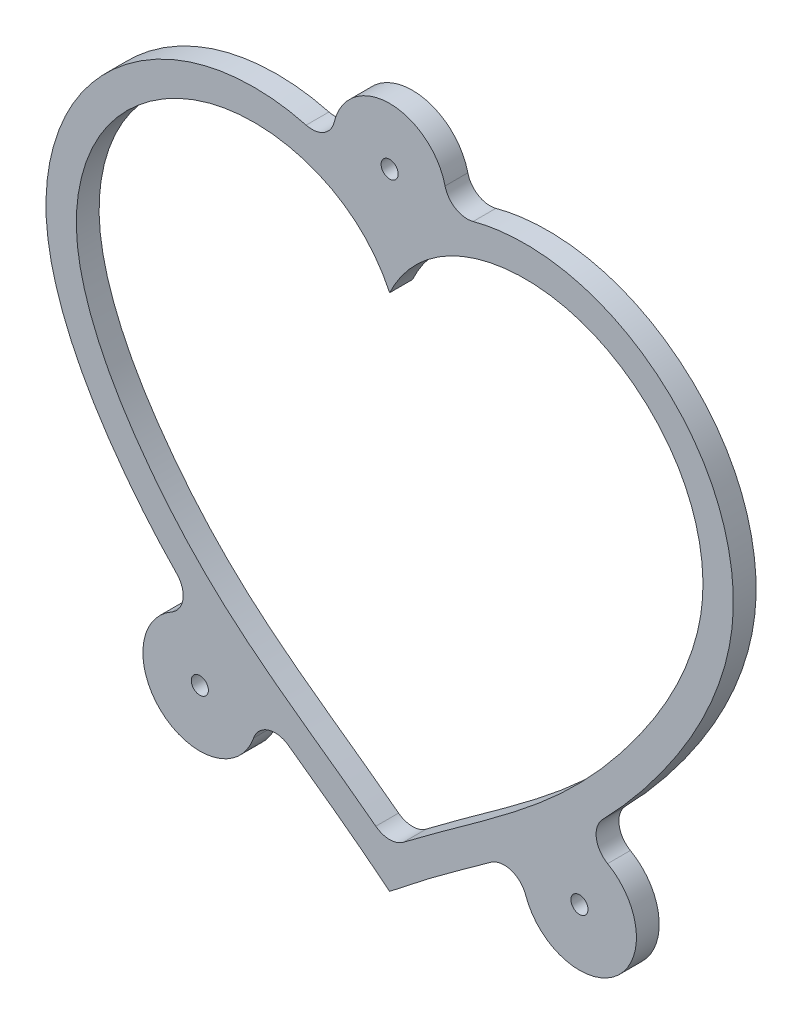
ISO-10303-21;
HEADER;
FILE_DESCRIPTION(('STEP AP214'),'2;1');
FILE_NAME('part.step','',(''),(''),'','','');
FILE_SCHEMA(('AUTOMOTIVE_DESIGN { 1 0 10303 214 1 1 1 1 }'));
ENDSEC;
DATA;
#1=APPLICATION_CONTEXT('core data for automotive mechanical design processes');
#2=APPLICATION_PROTOCOL_DEFINITION('international standard','automotive_design',2000,#1);
#3=PRODUCT_CONTEXT('',#1,'mechanical');
#4=PRODUCT('Part','Part','',(#3));
#5=PRODUCT_RELATED_PRODUCT_CATEGORY('part','',(#4));
#6=PRODUCT_DEFINITION_FORMATION('','',#4);
#7=PRODUCT_DEFINITION_CONTEXT('part definition',#1,'design');
#8=PRODUCT_DEFINITION('design','',#6,#7);
#9=PRODUCT_DEFINITION_SHAPE('','',#8);
#10=(LENGTH_UNIT() NAMED_UNIT(*) SI_UNIT(.MILLI.,.METRE.));
#11=(NAMED_UNIT(*) PLANE_ANGLE_UNIT() SI_UNIT($,.RADIAN.));
#12=(NAMED_UNIT(*) SI_UNIT($,.STERADIAN.) SOLID_ANGLE_UNIT());
#13=UNCERTAINTY_MEASURE_WITH_UNIT(LENGTH_MEASURE(1.E-05),#10,'distance_accuracy_value','');
#14=(GEOMETRIC_REPRESENTATION_CONTEXT(3) GLOBAL_UNCERTAINTY_ASSIGNED_CONTEXT((#13)) GLOBAL_UNIT_ASSIGNED_CONTEXT((#10,
#11,#12)) REPRESENTATION_CONTEXT('',''));
#15=CARTESIAN_POINT('',(0.,0.,0.));
#16=DIRECTION('',(0.,0.,1.));
#17=DIRECTION('',(1.,0.,0.));
#18=AXIS2_PLACEMENT_3D('',#15,#16,#17);
#19=CARTESIAN_POINT('',(82.4726160950661,-10.2094009049258,6.));
#20=CARTESIAN_POINT('',(83.4714639574229,-9.41745694634924,6.));
#21=CARTESIAN_POINT('',(84.9645223253859,-8.23383301928179,6.));
#22=CARTESIAN_POINT('',(86.9761205182926,-6.63849974000241,6.));
#23=CARTESIAN_POINT('',(88.9182063702341,-5.10039327135454,6.));
#24=CARTESIAN_POINT('',(91.3656471995338,-3.21331902466197,6.));
#25=CARTESIAN_POINT('',(95.3579281311431,-0.210302632343623,6.));
#26=CARTESIAN_POINT('',(100.453917795638,3.50911955569531,6.));
#27=CARTESIAN_POINT('',(108.764929662189,9.48183813336912,6.));
#28=CARTESIAN_POINT('',(119.291741188994,17.144694680426,6.));
#29=CARTESIAN_POINT('',(129.618307931992,25.5586824907125,6.));
#30=CARTESIAN_POINT('',(137.443209961277,33.0087837344442,6.));
#31=CARTESIAN_POINT('',(144.859917451755,40.8364073254824,6.));
#32=CARTESIAN_POINT('',(151.674556145459,49.219363645059,6.));
#33=CARTESIAN_POINT('',(157.859264063419,58.0742525719499,6.));
#34=CARTESIAN_POINT('',(162.17432774299,65.0719663575805,6.));
#35=CARTESIAN_POINT('',(166.016075969879,72.455491772311,6.));
#36=CARTESIAN_POINT('',(169.258908350085,80.2437219507198,6.));
#37=CARTESIAN_POINT('',(171.755986150504,88.5629358572733,6.));
#38=CARTESIAN_POINT('',(173.140367723534,97.4252357863841,6.));
#39=CARTESIAN_POINT('',(172.977670445687,106.596327776455,6.));
#40=CARTESIAN_POINT('',(171.275944480674,115.572236386053,6.));
#41=CARTESIAN_POINT('',(168.086640527527,124.198944653081,6.));
#42=CARTESIAN_POINT('',(163.387201588641,132.199804754494,6.));
#43=CARTESIAN_POINT('',(157.426131983563,139.212591541545,6.));
#44=CARTESIAN_POINT('',(150.41006343557,145.163269136889,6.));
#45=CARTESIAN_POINT('',(142.522093284897,149.916495524305,6.));
#46=CARTESIAN_POINT('',(133.911988841613,153.340421029907,6.));
#47=CARTESIAN_POINT('',(124.814763458287,155.238581255719,6.));
#48=CARTESIAN_POINT('',(115.589351661553,155.582375027217,6.));
#49=CARTESIAN_POINT('',(106.444811245433,154.368542179928,6.));
#50=CARTESIAN_POINT('',(97.6398439983744,151.550198602041,6.));
#51=CARTESIAN_POINT('',(90.8163224260135,147.801965868724,6.));
#52=CARTESIAN_POINT('',(85.8526566419993,143.947549857758,6.));
#53=CARTESIAN_POINT('',(83.5505977943366,141.713863228974,6.));
#54=CARTESIAN_POINT('',(82.472616095066,140.542379671031,6.));
#55=B_SPLINE_CURVE_WITH_KNOTS('',3,(#19,#20,#21,#22,#23,#24,#25,#26,#27,#28,#29,#30,#31,#32,#33,
#34,#35,#36,#37,#38,#39,#40,#41,#42,#43,#44,#45,#46,#47,#48,#49,#50,#51,#52,#53,#54),
.UNSPECIFIED.,.F.,.F.,(4,1,1,1,1,1,1,1,1,1,1,1,1,1,1,1,1,1,1,1,1,1,1,1,1,1,1,1,1,1,1,1,1,4),
(-0.0255266342744863,-0.0101366089676064,-0.00244159631416641,0.00525341633927356,
0.0206434416461535,0.0360334669530334,0.0668135175667933,0.0975935681805533,0.159153669408073,
0.220713770635593,0.251493821249353,0.282273871863113,0.343833973090632,0.374614023704392,
0.405394074318152,0.436174124931912,0.466954175545672,0.497734226159432,0.528514276773192,
0.559294327386952,0.590074378000712,0.620854428614472,0.651634479228232,0.682414529841991,
0.713194580455751,0.743974631069511,0.774754681683271,0.805534732297031,0.836314782910791,
0.867094833524551,0.897874884138311,0.928654934752071,0.94404496005895,0.95943498536583),.UNSPECIFIED.);
#56=DIRECTION('',(0.,0.,-1.));
#57=VECTOR('',#56,1.);
#58=SURFACE_OF_LINEAR_EXTRUSION('',#55,#57);
#59=CARTESIAN_POINT('',(82.4726160950661,-10.2094009049258,0.));
#60=CARTESIAN_POINT('',(83.4714639574229,-9.41745694634924,0.));
#61=CARTESIAN_POINT('',(84.9645223253859,-8.23383301928179,0.));
#62=CARTESIAN_POINT('',(86.9761205182926,-6.63849974000241,0.));
#63=CARTESIAN_POINT('',(88.9182063702341,-5.10039327135454,0.));
#64=CARTESIAN_POINT('',(91.3656471995338,-3.21331902466197,0.));
#65=CARTESIAN_POINT('',(95.3579281311431,-0.210302632343623,0.));
#66=CARTESIAN_POINT('',(100.453917795638,3.50911955569531,0.));
#67=CARTESIAN_POINT('',(108.764929662189,9.48183813336912,0.));
#68=CARTESIAN_POINT('',(119.291741188994,17.144694680426,0.));
#69=CARTESIAN_POINT('',(129.618307931992,25.5586824907125,0.));
#70=CARTESIAN_POINT('',(137.443209961277,33.0087837344442,0.));
#71=CARTESIAN_POINT('',(144.859917451755,40.8364073254824,0.));
#72=CARTESIAN_POINT('',(151.674556145459,49.219363645059,0.));
#73=CARTESIAN_POINT('',(157.859264063419,58.0742525719499,0.));
#74=CARTESIAN_POINT('',(162.17432774299,65.0719663575805,0.));
#75=CARTESIAN_POINT('',(166.016075969879,72.455491772311,0.));
#76=CARTESIAN_POINT('',(169.258908350085,80.2437219507198,0.));
#77=CARTESIAN_POINT('',(171.755986150504,88.5629358572733,0.));
#78=CARTESIAN_POINT('',(173.140367723534,97.4252357863841,0.));
#79=CARTESIAN_POINT('',(172.977670445687,106.596327776455,0.));
#80=CARTESIAN_POINT('',(171.275944480674,115.572236386053,0.));
#81=CARTESIAN_POINT('',(168.086640527527,124.198944653081,0.));
#82=CARTESIAN_POINT('',(163.387201588641,132.199804754494,0.));
#83=CARTESIAN_POINT('',(157.426131983563,139.212591541545,0.));
#84=CARTESIAN_POINT('',(150.41006343557,145.163269136889,0.));
#85=CARTESIAN_POINT('',(142.522093284897,149.916495524305,0.));
#86=CARTESIAN_POINT('',(133.911988841613,153.340421029907,0.));
#87=CARTESIAN_POINT('',(124.814763458287,155.238581255719,0.));
#88=CARTESIAN_POINT('',(115.589351661553,155.582375027217,0.));
#89=CARTESIAN_POINT('',(106.444811245433,154.368542179928,0.));
#90=CARTESIAN_POINT('',(97.6398439983744,151.550198602041,0.));
#91=CARTESIAN_POINT('',(90.8163224260135,147.801965868724,0.));
#92=CARTESIAN_POINT('',(85.8526566419993,143.947549857758,0.));
#93=CARTESIAN_POINT('',(83.5505977943366,141.713863228974,0.));
#94=CARTESIAN_POINT('',(82.472616095066,140.542379671031,0.));
#95=B_SPLINE_CURVE_WITH_KNOTS('',3,(#59,#60,#61,#62,#63,#64,#65,#66,#67,#68,#69,#70,#71,#72,#73,
#74,#75,#76,#77,#78,#79,#80,#81,#82,#83,#84,#85,#86,#87,#88,#89,#90,#91,#92,#93,#94),
.UNSPECIFIED.,.F.,.F.,(4,1,1,1,1,1,1,1,1,1,1,1,1,1,1,1,1,1,1,1,1,1,1,1,1,1,1,1,1,1,1,1,1,4),
(-0.0255266342744863,-0.0101366089676064,-0.00244159631416641,0.00525341633927356,
0.0206434416461535,0.0360334669530334,0.0668135175667933,0.0975935681805533,0.159153669408073,
0.220713770635593,0.251493821249353,0.282273871863113,0.343833973090632,0.374614023704392,
0.405394074318152,0.436174124931912,0.466954175545672,0.497734226159432,0.528514276773192,
0.559294327386952,0.590074378000712,0.620854428614472,0.651634479228232,0.682414529841991,
0.713194580455751,0.743974631069511,0.774754681683271,0.805534732297031,0.836314782910791,
0.867094833524551,0.897874884138311,0.928654934752071,0.94404496005895,0.95943498536583),.UNSPECIFIED.);
#96=CARTESIAN_POINT('',(82.4726160950661,-10.2094009049258,0.));
#97=VERTEX_POINT('',#96);
#98=CARTESIAN_POINT('',(109.113832741653,9.75063396404658,0.));
#99=VERTEX_POINT('',#98);
#100=EDGE_CURVE('E209',#97,#99,#95,.T.);
#101=ORIENTED_EDGE('',*,*,#100,.T.);
#102=DIRECTION('',(0.,0.,-1.));
#103=VECTOR('',#102,1.);
#104=CARTESIAN_POINT('',(109.113832741653,9.75063396404658,0.));
#105=LINE('',#104,#103);
#106=CARTESIAN_POINT('',(109.113832741653,9.75063396404658,6.));
#107=VERTEX_POINT('',#106);
#108=EDGE_CURVE('E251',#99,#107,#105,.F.);
#109=ORIENTED_EDGE('',*,*,#108,.T.);
#110=CARTESIAN_POINT('',(82.4726160950661,-10.2094009049258,6.));
#111=VERTEX_POINT('',#110);
#112=EDGE_CURVE('E205',#111,#107,#55,.T.);
#113=ORIENTED_EDGE('',*,*,#112,.F.);
#114=DIRECTION('',(0.,0.,-1.));
#115=VECTOR('',#114,1.);
#116=CARTESIAN_POINT('',(82.4726160950661,-10.2094009049258,6.));
#117=LINE('',#116,#115);
#118=EDGE_CURVE('E225',#111,#97,#117,.T.);
#119=ORIENTED_EDGE('',*,*,#118,.T.);
#120=EDGE_LOOP('',(#101,#109,#113,#119));
#121=FACE_BOUND('',#120,.T.);
#122=ADVANCED_FACE('F33',(#121),#58,.F.);
#123=CARTESIAN_POINT('',(82.4726160950661,140.542379671031,6.));
#124=CARTESIAN_POINT('',(81.3946343957955,141.713863228974,6.));
#125=CARTESIAN_POINT('',(79.0925755481329,143.947549857758,6.));
#126=CARTESIAN_POINT('',(74.1289097641186,147.801965868724,6.));
#127=CARTESIAN_POINT('',(67.3053881917577,151.550198602041,6.));
#128=CARTESIAN_POINT('',(58.500420944699,154.368542179928,6.));
#129=CARTESIAN_POINT('',(49.3558805285793,155.582375027217,6.));
#130=CARTESIAN_POINT('',(40.1304687318451,155.23858125572,6.));
#131=CARTESIAN_POINT('',(31.0332433485191,153.340421029907,6.));
#132=CARTESIAN_POINT('',(22.4231389052352,149.916495524305,6.));
#133=CARTESIAN_POINT('',(14.5351687545622,145.163269136889,6.));
#134=CARTESIAN_POINT('',(7.5191002065696,139.212591541545,6.));
#135=CARTESIAN_POINT('',(1.55803060149126,132.199804754494,6.));
#136=CARTESIAN_POINT('',(-3.14140833739441,124.198944653081,6.));
#137=CARTESIAN_POINT('',(-6.33071229054134,115.572236386053,6.));
#138=CARTESIAN_POINT('',(-8.03243825555483,106.596327776455,6.));
#139=CARTESIAN_POINT('',(-8.19513553340165,97.4252357863841,6.));
#140=CARTESIAN_POINT('',(-6.81075396037155,88.5629358572733,6.));
#141=CARTESIAN_POINT('',(-4.31367615995275,80.2437219507198,6.));
#142=CARTESIAN_POINT('',(-1.07084377974669,72.455491772311,6.));
#143=CARTESIAN_POINT('',(2.770904447142,65.0719663575805,6.));
#144=CARTESIAN_POINT('',(7.08596812671271,58.0742525719499,6.));
#145=CARTESIAN_POINT('',(13.2706760446727,49.219363645059,6.));
#146=CARTESIAN_POINT('',(20.0853147383774,40.8364073254824,6.));
#147=CARTESIAN_POINT('',(27.5020222288551,33.0087837344442,6.));
#148=CARTESIAN_POINT('',(35.3269242581406,25.5586824907125,6.));
#149=CARTESIAN_POINT('',(45.6534910011384,17.144694680426,6.));
#150=CARTESIAN_POINT('',(56.1803025279432,9.48183813336911,6.));
#151=CARTESIAN_POINT('',(64.4913143944945,3.50911955569532,6.));
#152=CARTESIAN_POINT('',(69.587304058989,-0.21030263234362,6.));
#153=CARTESIAN_POINT('',(73.5795849905983,-3.21331902466197,6.));
#154=CARTESIAN_POINT('',(76.027025819898,-5.10039327135453,6.));
#155=CARTESIAN_POINT('',(77.9691116718395,-6.63849974000241,6.));
#156=CARTESIAN_POINT('',(79.9807098647463,-8.23383301928179,6.));
#157=CARTESIAN_POINT('',(81.4737682327092,-9.41745694634924,6.));
#158=CARTESIAN_POINT('',(82.4726160950661,-10.2094009049258,6.));
#159=B_SPLINE_CURVE_WITH_KNOTS('',3,(#123,#124,#125,#126,#127,#128,#129,#130,#131,#132,#133,
#134,#135,#136,#137,#138,#139,#140,#141,#142,#143,#144,#145,#146,#147,#148,#149,#150,#151,#152,
#153,#154,#155,#156,#157,#158),.UNSPECIFIED.,.F.,.F.,(4,1,1,1,1,1,1,1,1,1,1,1,1,1,1,1,1,1,1,1,1,
1,1,1,1,1,1,1,1,1,1,1,1,4),(-0.0255266342744863,-0.0101366089676063,0.00525341633927368,
0.0360334669530336,0.0668135175667934,0.0975935681805533,0.128373618794313,0.159153669408073,
0.189933720021833,0.220713770635593,0.251493821249353,0.282273871863113,0.313053922476872,
0.343833973090632,0.374614023704392,0.405394074318152,0.436174124931912,0.466954175545672,
0.497734226159432,0.528514276773192,0.559294327386952,0.590074378000712,0.651634479228231,
0.682414529841991,0.713194580455751,0.774754681683271,0.836314782910791,0.867094833524551,
0.897874884138311,0.913264909445191,0.928654934752071,0.936349947405511,0.944044960058951,
0.95943498536583),.UNSPECIFIED.);
#160=DIRECTION('',(0.,0.,-1.));
#161=VECTOR('',#160,1.);
#162=SURFACE_OF_LINEAR_EXTRUSION('',#159,#161);
#163=CARTESIAN_POINT('',(60.4859567395278,153.598191897514,6.));
#164=VERTEX_POINT('',#163);
#165=CARTESIAN_POINT('',(26.3854413563127,34.2387781694007,6.));
#166=VERTEX_POINT('',#165);
#167=EDGE_CURVE('E204',#164,#166,#159,.T.);
#168=ORIENTED_EDGE('',*,*,#167,.F.);
#169=DIRECTION('',(0.,0.,-1.));
#170=VECTOR('',#169,1.);
#171=CARTESIAN_POINT('',(60.4859567395278,153.598191897514,6.));
#172=LINE('',#171,#170);
#173=CARTESIAN_POINT('',(60.4859567395278,153.598191897514,0.));
#174=VERTEX_POINT('',#173);
#175=EDGE_CURVE('E234',#164,#174,#172,.T.);
#176=ORIENTED_EDGE('',*,*,#175,.T.);
#177=CARTESIAN_POINT('',(82.4726160950661,140.542379671031,0.));
#178=CARTESIAN_POINT('',(81.3946343957955,141.713863228974,0.));
#179=CARTESIAN_POINT('',(79.0925755481329,143.947549857758,0.));
#180=CARTESIAN_POINT('',(74.1289097641186,147.801965868724,0.));
#181=CARTESIAN_POINT('',(67.3053881917577,151.550198602041,0.));
#182=CARTESIAN_POINT('',(58.500420944699,154.368542179928,0.));
#183=CARTESIAN_POINT('',(49.3558805285793,155.582375027217,0.));
#184=CARTESIAN_POINT('',(40.1304687318451,155.23858125572,0.));
#185=CARTESIAN_POINT('',(31.0332433485191,153.340421029907,0.));
#186=CARTESIAN_POINT('',(22.4231389052352,149.916495524305,0.));
#187=CARTESIAN_POINT('',(14.5351687545622,145.163269136889,0.));
#188=CARTESIAN_POINT('',(7.5191002065696,139.212591541545,0.));
#189=CARTESIAN_POINT('',(1.55803060149126,132.199804754494,0.));
#190=CARTESIAN_POINT('',(-3.14140833739441,124.198944653081,0.));
#191=CARTESIAN_POINT('',(-6.33071229054134,115.572236386053,0.));
#192=CARTESIAN_POINT('',(-8.03243825555483,106.596327776455,0.));
#193=CARTESIAN_POINT('',(-8.19513553340165,97.4252357863841,0.));
#194=CARTESIAN_POINT('',(-6.81075396037155,88.5629358572733,0.));
#195=CARTESIAN_POINT('',(-4.31367615995275,80.2437219507198,0.));
#196=CARTESIAN_POINT('',(-1.07084377974669,72.455491772311,0.));
#197=CARTESIAN_POINT('',(2.770904447142,65.0719663575805,0.));
#198=CARTESIAN_POINT('',(7.08596812671271,58.0742525719499,0.));
#199=CARTESIAN_POINT('',(13.2706760446727,49.219363645059,0.));
#200=CARTESIAN_POINT('',(20.0853147383774,40.8364073254824,0.));
#201=CARTESIAN_POINT('',(27.5020222288551,33.0087837344442,0.));
#202=CARTESIAN_POINT('',(35.3269242581406,25.5586824907125,0.));
#203=CARTESIAN_POINT('',(45.6534910011384,17.144694680426,0.));
#204=CARTESIAN_POINT('',(56.1803025279432,9.48183813336911,0.));
#205=CARTESIAN_POINT('',(64.4913143944945,3.50911955569532,0.));
#206=CARTESIAN_POINT('',(69.587304058989,-0.21030263234362,0.));
#207=CARTESIAN_POINT('',(73.5795849905983,-3.21331902466197,0.));
#208=CARTESIAN_POINT('',(76.027025819898,-5.10039327135453,0.));
#209=CARTESIAN_POINT('',(77.9691116718395,-6.63849974000241,0.));
#210=CARTESIAN_POINT('',(79.9807098647463,-8.23383301928179,0.));
#211=CARTESIAN_POINT('',(81.4737682327092,-9.41745694634924,0.));
#212=CARTESIAN_POINT('',(82.4726160950661,-10.2094009049258,0.));
#213=B_SPLINE_CURVE_WITH_KNOTS('',3,(#177,#178,#179,#180,#181,#182,#183,#184,#185,#186,#187,
#188,#189,#190,#191,#192,#193,#194,#195,#196,#197,#198,#199,#200,#201,#202,#203,#204,#205,#206,
#207,#208,#209,#210,#211,#212),.UNSPECIFIED.,.F.,.F.,(4,1,1,1,1,1,1,1,1,1,1,1,1,1,1,1,1,1,1,1,1,
1,1,1,1,1,1,1,1,1,1,1,1,4),(-0.0255266342744863,-0.0101366089676063,0.00525341633927368,
0.0360334669530336,0.0668135175667934,0.0975935681805533,0.128373618794313,0.159153669408073,
0.189933720021833,0.220713770635593,0.251493821249353,0.282273871863113,0.313053922476872,
0.343833973090632,0.374614023704392,0.405394074318152,0.436174124931912,0.466954175545672,
0.497734226159432,0.528514276773192,0.559294327386952,0.590074378000712,0.651634479228231,
0.682414529841991,0.713194580455751,0.774754681683271,0.836314782910791,0.867094833524551,
0.897874884138311,0.913264909445191,0.928654934752071,0.936349947405511,0.944044960058951,
0.95943498536583),.UNSPECIFIED.);
#214=CARTESIAN_POINT('',(26.3854413563127,34.2387781694007,0.));
#215=VERTEX_POINT('',#214);
#216=EDGE_CURVE('E224',#174,#215,#213,.T.);
#217=ORIENTED_EDGE('',*,*,#216,.T.);
#218=DIRECTION('',(0.,0.,-1.));
#219=VECTOR('',#218,1.);
#220=CARTESIAN_POINT('',(26.3854413563127,34.2387781694007,0.));
#221=LINE('',#220,#219);
#222=EDGE_CURVE('E231',#215,#166,#221,.F.);
#223=ORIENTED_EDGE('',*,*,#222,.T.);
#224=EDGE_LOOP('',(#168,#176,#217,#223));
#225=FACE_BOUND('',#224,.T.);
#226=ADVANCED_FACE('F187',(#225),#162,.F.);
#227=CARTESIAN_POINT('',(169.13461592012,80.3322192387439,6.));
#228=DIRECTION('',(0.,0.,1.));
#229=DIRECTION('',(1.,0.,0.));
#230=AXIS2_PLACEMENT_3D('',#227,#228,#229);
#231=PLANE('',#230);
#232=CARTESIAN_POINT('',(138.559790833819,34.2387781694007,6.));
#233=VERTEX_POINT('',#232);
#234=CARTESIAN_POINT('',(104.459275450604,153.598191897514,6.));
#235=VERTEX_POINT('',#234);
#236=EDGE_CURVE('E379',#233,#235,#55,.T.);
#237=ORIENTED_EDGE('',*,*,#236,.T.);
#238=CARTESIAN_POINT('',(102.904665601867,159.393292260598,6.));
#239=DIRECTION('',(0.,0.,1.));
#240=DIRECTION('',(1.,0.,0.));
#241=AXIS2_PLACEMENT_3D('',#238,#239,#240);
#242=CIRCLE('',#241,6.);
#243=CARTESIAN_POINT('',(97.0669371713527,158.007317235007,6.));
#244=VERTEX_POINT('',#243);
#245=EDGE_CURVE('E268',#235,#244,#242,.F.);
#246=ORIENTED_EDGE('',*,*,#245,.T.);
#247=CARTESIAN_POINT('',(82.4726160950661,154.542379671031,6.));
#248=DIRECTION('',(0.,0.,1.));
#249=DIRECTION('',(1.,0.,0.));
#250=AXIS2_PLACEMENT_3D('',#247,#248,#249);
#251=CIRCLE('',#250,15.);
#252=CARTESIAN_POINT('',(67.8782950187795,158.007317235007,6.));
#253=VERTEX_POINT('',#252);
#254=EDGE_CURVE('E329',#244,#253,#251,.T.);
#255=ORIENTED_EDGE('',*,*,#254,.T.);
#256=CARTESIAN_POINT('',(62.0405665882648,159.393292260598,6.));
#257=DIRECTION('',(0.,0.,1.));
#258=DIRECTION('',(1.,0.,0.));
#259=AXIS2_PLACEMENT_3D('',#256,#257,#258);
#260=CIRCLE('',#259,6.);
#261=EDGE_CURVE('E266',#253,#164,#260,.F.);
#262=ORIENTED_EDGE('',*,*,#261,.T.);
#263=ORIENTED_EDGE('',*,*,#167,.T.);
#264=CARTESIAN_POINT('',(22.0932654357811,30.0462579408021,6.));
#265=DIRECTION('',(0.,0.,1.));
#266=DIRECTION('',(1.,0.,0.));
#267=AXIS2_PLACEMENT_3D('',#264,#265,#266);
#268=CIRCLE('',#267,6.);
#269=CARTESIAN_POINT('',(25.0587941955768,24.8303554134513,6.));
#270=VERTEX_POINT('',#269);
#271=EDGE_CURVE('E280',#166,#270,#268,.F.);
#272=ORIENTED_EDGE('',*,*,#271,.T.);
#273=CARTESIAN_POINT('',(32.4726160950661,11.7905990950742,6.));
#274=DIRECTION('',(0.,0.,1.));
#275=DIRECTION('',(1.,0.,0.));
#276=AXIS2_PLACEMENT_3D('',#273,#274,#275);
#277=CIRCLE('',#276,15.);
#278=CARTESIAN_POINT('',(46.6406931491267,6.86458726092274,6.));
#279=VERTEX_POINT('',#278);
#280=EDGE_CURVE('E169',#270,#279,#277,.T.);
#281=ORIENTED_EDGE('',*,*,#280,.T.);
#282=CARTESIAN_POINT('',(52.307923970751,4.89418252726215,6.));
#283=DIRECTION('',(0.,0.,1.));
#284=DIRECTION('',(1.,0.,0.));
#285=AXIS2_PLACEMENT_3D('',#282,#283,#284);
#286=CIRCLE('',#285,6.);
#287=CARTESIAN_POINT('',(55.8313994484795,9.75063396404657,6.));
#288=VERTEX_POINT('',#287);
#289=EDGE_CURVE('E286',#279,#288,#286,.F.);
#290=ORIENTED_EDGE('',*,*,#289,.T.);
#291=EDGE_CURVE('E199',#288,#111,#159,.T.);
#292=ORIENTED_EDGE('',*,*,#291,.T.);
#293=ORIENTED_EDGE('',*,*,#112,.T.);
#294=CARTESIAN_POINT('',(112.637308219381,4.89418252726216,6.));
#295=DIRECTION('',(0.,0.,1.));
#296=DIRECTION('',(1.,0.,0.));
#297=AXIS2_PLACEMENT_3D('',#294,#295,#296);
#298=CIRCLE('',#297,6.);
#299=CARTESIAN_POINT('',(118.304539041005,6.86458726092274,6.));
#300=VERTEX_POINT('',#299);
#301=EDGE_CURVE('E276',#107,#300,#298,.F.);
#302=ORIENTED_EDGE('',*,*,#301,.T.);
#303=CARTESIAN_POINT('',(132.472616095066,11.7905990950742,6.));
#304=DIRECTION('',(0.,0.,1.));
#305=DIRECTION('',(-1.,0.,0.));
#306=AXIS2_PLACEMENT_3D('',#303,#304,#305);
#307=CIRCLE('',#306,15.);
#308=CARTESIAN_POINT('',(139.886437994555,24.8303554134513,6.));
#309=VERTEX_POINT('',#308);
#310=EDGE_CURVE('E317',#300,#309,#307,.T.);
#311=ORIENTED_EDGE('',*,*,#310,.T.);
#312=CARTESIAN_POINT('',(142.851966754351,30.0462579408021,6.));
#313=DIRECTION('',(0.,0.,1.));
#314=DIRECTION('',(1.,0.,0.));
#315=AXIS2_PLACEMENT_3D('',#312,#313,#314);
#316=CIRCLE('',#315,6.);
#317=EDGE_CURVE('E274',#309,#233,#316,.F.);
#318=ORIENTED_EDGE('',*,*,#317,.T.);
#319=EDGE_LOOP('',(#237,#246,#255,#262,#263,#272,#281,#290,#292,#293,#302,#311,#318));
#320=FACE_BOUND('',#319,.T.);
#321=CARTESIAN_POINT('',(82.4726160950661,0.,6.));
#322=CARTESIAN_POINT('',(97.00136512069,11.5192267512776,6.));
#323=CARTESIAN_POINT('',(122.367511009724,27.1596645276851,6.));
#324=CARTESIAN_POINT('',(147.66445544593,55.9473525286211,6.));
#325=CARTESIAN_POINT('',(160.776944751644,78.1075815529436,6.));
#326=CARTESIAN_POINT('',(166.836954821545,100.903984809001,6.));
#327=CARTESIAN_POINT('',(160.564003732808,128.294665652817,6.));
#328=CARTESIAN_POINT('',(126.577250321467,154.854375307356,6.));
#329=CARTESIAN_POINT('',(91.0666211872104,144.596317398055,6.));
#330=CARTESIAN_POINT('',(82.4726160950661,126.350308344485,6.));
#331=B_SPLINE_CURVE_WITH_KNOTS('',3,(#321,#322,#323,#324,#325,#326,#327,#328,#329,#330),
.UNSPECIFIED.,.F.,.F.,(4,1,1,1,1,1,1,4),(0.,0.22385572779228,0.354281410137953,0.45743514941976,
0.531451174408718,0.633256173985896,0.77721075461617,1.),.UNSPECIFIED.);
#332=CARTESIAN_POINT('',(86.1166810580877,2.83508288700521,6.));
#333=VERTEX_POINT('',#332);
#334=CARTESIAN_POINT('',(82.4726160950661,126.350308344485,6.));
#335=VERTEX_POINT('',#334);
#336=EDGE_CURVE('E142',#333,#335,#331,.T.);
#337=ORIENTED_EDGE('',*,*,#336,.F.);
#338=CARTESIAN_POINT('',(82.4726160950661,7.6017159277666,6.));
#339=DIRECTION('',(0.,0.,1.));
#340=DIRECTION('',(1.,0.,0.));
#341=AXIS2_PLACEMENT_3D('',#338,#339,#340);
#342=CIRCLE('',#341,6.);
#343=CARTESIAN_POINT('',(78.8285511320444,2.83508288700521,6.));
#344=VERTEX_POINT('',#343);
#345=EDGE_CURVE('E11',#333,#344,#342,.F.);
#346=ORIENTED_EDGE('',*,*,#345,.T.);
#347=CARTESIAN_POINT('',(82.4726160950661,126.350308344485,6.));
#348=CARTESIAN_POINT('',(73.8786110029217,144.596317398055,6.));
#349=CARTESIAN_POINT('',(38.367981868665,154.854375307356,6.));
#350=CARTESIAN_POINT('',(4.38122845732449,128.294665652817,6.));
#351=CARTESIAN_POINT('',(-1.89172263141334,100.903984809001,6.));
#352=CARTESIAN_POINT('',(4.16828743848839,78.1075815529436,6.));
#353=CARTESIAN_POINT('',(17.2807767442023,55.9473525286211,6.));
#354=CARTESIAN_POINT('',(42.5777211804077,27.1596645276851,6.));
#355=CARTESIAN_POINT('',(67.9438670694421,11.5192267512776,6.));
#356=CARTESIAN_POINT('',(82.4726160950661,0.,6.));
#357=B_SPLINE_CURVE_WITH_KNOTS('',3,(#347,#348,#349,#350,#351,#352,#353,#354,#355,#356),
.UNSPECIFIED.,.F.,.F.,(4,1,1,1,1,1,1,4),(0.,0.22278924538383,0.366743826014104,
0.468548825591282,0.54256485058024,0.645718589862047,0.77614427220772,1.),.UNSPECIFIED.);
#358=EDGE_CURVE('E149',#335,#344,#357,.T.);
#359=ORIENTED_EDGE('',*,*,#358,.F.);
#360=EDGE_LOOP('',(#337,#346,#359));
#361=FACE_BOUND('',#360,.T.);
#362=CARTESIAN_POINT('',(32.4726160950661,11.7905990950742,6.));
#363=DIRECTION('',(0.,0.,1.));
#364=DIRECTION('',(1.,0.,0.));
#365=AXIS2_PLACEMENT_3D('',#362,#363,#364);
#366=CIRCLE('',#365,2.25);
#367=CARTESIAN_POINT('',(34.7226160950661,11.7905990950742,6.));
#368=VERTEX_POINT('',#367);
#369=EDGE_CURVE('E311',#368,#368,#366,.T.);
#370=ORIENTED_EDGE('',*,*,#369,.F.);
#371=EDGE_LOOP('',(#370));
#372=FACE_BOUND('',#371,.T.);
#373=CARTESIAN_POINT('',(132.472616095066,11.7905990950742,6.));
#374=DIRECTION('',(0.,0.,1.));
#375=DIRECTION('',(-1.,0.,0.));
#376=AXIS2_PLACEMENT_3D('',#373,#374,#375);
#377=CIRCLE('',#376,2.25000000000001);
#378=CARTESIAN_POINT('',(130.222616095066,11.7905990950742,6.));
#379=VERTEX_POINT('',#378);
#380=EDGE_CURVE('E323',#379,#379,#377,.T.);
#381=ORIENTED_EDGE('',*,*,#380,.F.);
#382=EDGE_LOOP('',(#381));
#383=FACE_BOUND('',#382,.T.);
#384=CARTESIAN_POINT('',(82.4726160950661,154.542379671031,6.));
#385=DIRECTION('',(0.,0.,1.));
#386=DIRECTION('',(1.,0.,0.));
#387=AXIS2_PLACEMENT_3D('',#384,#385,#386);
#388=CIRCLE('',#387,2.25);
#389=CARTESIAN_POINT('',(84.7226160950661,154.542379671031,6.));
#390=VERTEX_POINT('',#389);
#391=EDGE_CURVE('E335',#390,#390,#388,.T.);
#392=ORIENTED_EDGE('',*,*,#391,.F.);
#393=EDGE_LOOP('',(#392));
#394=FACE_BOUND('',#393,.T.);
#395=ADVANCED_FACE('F160',(#320,#361,#372,#383,#394),#231,.T.);
#396=CARTESIAN_POINT('',(169.13461592012,80.3322192387439,0.));
#397=DIRECTION('',(0.,0.,1.));
#398=DIRECTION('',(1.,0.,0.));
#399=AXIS2_PLACEMENT_3D('',#396,#397,#398);
#400=PLANE('',#399);
#401=ORIENTED_EDGE('',*,*,#216,.F.);
#402=CARTESIAN_POINT('',(62.0405665882648,159.393292260598,0.));
#403=DIRECTION('',(0.,0.,1.));
#404=DIRECTION('',(1.,0.,0.));
#405=AXIS2_PLACEMENT_3D('',#402,#403,#404);
#406=CIRCLE('',#405,6.);
#407=CARTESIAN_POINT('',(67.8782950187795,158.007317235007,0.));
#408=VERTEX_POINT('',#407);
#409=EDGE_CURVE('E264',#174,#408,#406,.T.);
#410=ORIENTED_EDGE('',*,*,#409,.T.);
#411=CARTESIAN_POINT('',(82.4726160950661,154.542379671031,0.));
#412=DIRECTION('',(0.,0.,1.));
#413=DIRECTION('',(1.,0.,0.));
#414=AXIS2_PLACEMENT_3D('',#411,#412,#413);
#415=CIRCLE('',#414,15.);
#416=CARTESIAN_POINT('',(97.0669371713527,158.007317235007,0.));
#417=VERTEX_POINT('',#416);
#418=EDGE_CURVE('E326',#417,#408,#415,.T.);
#419=ORIENTED_EDGE('',*,*,#418,.F.);
#420=CARTESIAN_POINT('',(102.904665601867,159.393292260598,0.));
#421=DIRECTION('',(0.,0.,1.));
#422=DIRECTION('',(1.,0.,0.));
#423=AXIS2_PLACEMENT_3D('',#420,#421,#422);
#424=CIRCLE('',#423,6.);
#425=CARTESIAN_POINT('',(104.459275450604,153.598191897514,0.));
#426=VERTEX_POINT('',#425);
#427=EDGE_CURVE('E270',#417,#426,#424,.T.);
#428=ORIENTED_EDGE('',*,*,#427,.T.);
#429=CARTESIAN_POINT('',(138.559790833819,34.2387781694008,0.));
#430=VERTEX_POINT('',#429);
#431=EDGE_CURVE('E158',#430,#426,#95,.T.);
#432=ORIENTED_EDGE('',*,*,#431,.F.);
#433=CARTESIAN_POINT('',(142.851966754351,30.0462579408021,0.));
#434=DIRECTION('',(0.,0.,1.));
#435=DIRECTION('',(1.,0.,0.));
#436=AXIS2_PLACEMENT_3D('',#433,#434,#435);
#437=CIRCLE('',#436,6.);
#438=CARTESIAN_POINT('',(139.886437994555,24.8303554134513,0.));
#439=VERTEX_POINT('',#438);
#440=EDGE_CURVE('E272',#430,#439,#437,.T.);
#441=ORIENTED_EDGE('',*,*,#440,.T.);
#442=CARTESIAN_POINT('',(132.472616095066,11.7905990950742,0.));
#443=DIRECTION('',(0.,0.,1.));
#444=DIRECTION('',(-1.,0.,0.));
#445=AXIS2_PLACEMENT_3D('',#442,#443,#444);
#446=CIRCLE('',#445,15.);
#447=CARTESIAN_POINT('',(118.304539041005,6.86458726092274,0.));
#448=VERTEX_POINT('',#447);
#449=EDGE_CURVE('E314',#448,#439,#446,.T.);
#450=ORIENTED_EDGE('',*,*,#449,.F.);
#451=CARTESIAN_POINT('',(112.637308219381,4.89418252726216,0.));
#452=DIRECTION('',(0.,0.,1.));
#453=DIRECTION('',(1.,0.,0.));
#454=AXIS2_PLACEMENT_3D('',#451,#452,#453);
#455=CIRCLE('',#454,6.);
#456=EDGE_CURVE('E278',#448,#99,#455,.T.);
#457=ORIENTED_EDGE('',*,*,#456,.T.);
#458=ORIENTED_EDGE('',*,*,#100,.F.);
#459=CARTESIAN_POINT('',(55.8313994484795,9.75063396404657,0.));
#460=VERTEX_POINT('',#459);
#461=EDGE_CURVE('E217',#460,#97,#213,.T.);
#462=ORIENTED_EDGE('',*,*,#461,.F.);
#463=CARTESIAN_POINT('',(52.307923970751,4.89418252726215,0.));
#464=DIRECTION('',(0.,0.,1.));
#465=DIRECTION('',(1.,0.,0.));
#466=AXIS2_PLACEMENT_3D('',#463,#464,#465);
#467=CIRCLE('',#466,6.);
#468=CARTESIAN_POINT('',(46.6406931491267,6.86458726092274,0.));
#469=VERTEX_POINT('',#468);
#470=EDGE_CURVE('E284',#460,#469,#467,.T.);
#471=ORIENTED_EDGE('',*,*,#470,.T.);
#472=CARTESIAN_POINT('',(32.4726160950661,11.7905990950742,0.));
#473=DIRECTION('',(0.,0.,1.));
#474=DIRECTION('',(1.,0.,0.));
#475=AXIS2_PLACEMENT_3D('',#472,#473,#474);
#476=CIRCLE('',#475,15.);
#477=CARTESIAN_POINT('',(25.0587941955768,24.8303554134513,0.));
#478=VERTEX_POINT('',#477);
#479=EDGE_CURVE('E303',#478,#469,#476,.T.);
#480=ORIENTED_EDGE('',*,*,#479,.F.);
#481=CARTESIAN_POINT('',(22.0932654357811,30.0462579408021,0.));
#482=DIRECTION('',(0.,0.,1.));
#483=DIRECTION('',(1.,0.,0.));
#484=AXIS2_PLACEMENT_3D('',#481,#482,#483);
#485=CIRCLE('',#484,6.);
#486=EDGE_CURVE('E282',#478,#215,#485,.T.);
#487=ORIENTED_EDGE('',*,*,#486,.T.);
#488=EDGE_LOOP('',(#401,#410,#419,#428,#432,#441,#450,#457,#458,#462,#471,#480,#487));
#489=FACE_BOUND('',#488,.T.);
#490=CARTESIAN_POINT('',(82.4726160950661,126.350308344485,0.));
#491=CARTESIAN_POINT('',(73.8786110029217,144.596317398055,0.));
#492=CARTESIAN_POINT('',(38.367981868665,154.854375307356,0.));
#493=CARTESIAN_POINT('',(4.38122845732449,128.294665652817,0.));
#494=CARTESIAN_POINT('',(-1.89172263141334,100.903984809001,0.));
#495=CARTESIAN_POINT('',(4.16828743848839,78.1075815529436,0.));
#496=CARTESIAN_POINT('',(17.2807767442023,55.9473525286211,0.));
#497=CARTESIAN_POINT('',(42.5777211804077,27.1596645276851,0.));
#498=CARTESIAN_POINT('',(67.9438670694421,11.5192267512776,0.));
#499=CARTESIAN_POINT('',(82.4726160950661,0.,0.));
#500=B_SPLINE_CURVE_WITH_KNOTS('',3,(#490,#491,#492,#493,#494,#495,#496,#497,#498,#499),
.UNSPECIFIED.,.F.,.F.,(4,1,1,1,1,1,1,4),(0.,0.22278924538383,0.366743826014104,
0.468548825591282,0.54256485058024,0.645718589862047,0.77614427220772,1.),.UNSPECIFIED.);
#501=CARTESIAN_POINT('',(82.4726160950661,126.350308344485,0.));
#502=VERTEX_POINT('',#501);
#503=CARTESIAN_POINT('',(78.8285511320444,2.83508288700521,0.));
#504=VERTEX_POINT('',#503);
#505=EDGE_CURVE('E157',#502,#504,#500,.T.);
#506=ORIENTED_EDGE('',*,*,#505,.T.);
#507=CARTESIAN_POINT('',(82.4726160950661,7.6017159277666,0.));
#508=DIRECTION('',(0.,0.,1.));
#509=DIRECTION('',(1.,0.,0.));
#510=AXIS2_PLACEMENT_3D('',#507,#508,#509);
#511=CIRCLE('',#510,6.);
#512=CARTESIAN_POINT('',(86.1166810580877,2.83508288700519,0.));
#513=VERTEX_POINT('',#512);
#514=EDGE_CURVE('E41',#504,#513,#511,.T.);
#515=ORIENTED_EDGE('',*,*,#514,.T.);
#516=CARTESIAN_POINT('',(82.4726160950661,0.,0.));
#517=CARTESIAN_POINT('',(97.00136512069,11.5192267512776,0.));
#518=CARTESIAN_POINT('',(122.367511009724,27.1596645276851,0.));
#519=CARTESIAN_POINT('',(147.66445544593,55.9473525286211,0.));
#520=CARTESIAN_POINT('',(160.776944751644,78.1075815529436,0.));
#521=CARTESIAN_POINT('',(166.836954821545,100.903984809001,0.));
#522=CARTESIAN_POINT('',(160.564003732808,128.294665652817,0.));
#523=CARTESIAN_POINT('',(126.577250321467,154.854375307356,0.));
#524=CARTESIAN_POINT('',(91.0666211872104,144.596317398055,0.));
#525=CARTESIAN_POINT('',(82.4726160950661,126.350308344485,0.));
#526=B_SPLINE_CURVE_WITH_KNOTS('',3,(#516,#517,#518,#519,#520,#521,#522,#523,#524,#525),
.UNSPECIFIED.,.F.,.F.,(4,1,1,1,1,1,1,4),(0.,0.22385572779228,0.354281410137953,0.45743514941976,
0.531451174408718,0.633256173985896,0.77721075461617,1.),.UNSPECIFIED.);
#527=EDGE_CURVE('E162',#513,#502,#526,.T.);
#528=ORIENTED_EDGE('',*,*,#527,.T.);
#529=EDGE_LOOP('',(#506,#515,#528));
#530=FACE_BOUND('',#529,.T.);
#531=CARTESIAN_POINT('',(32.4726160950661,11.7905990950742,0.));
#532=DIRECTION('',(0.,0.,1.));
#533=DIRECTION('',(1.,0.,0.));
#534=AXIS2_PLACEMENT_3D('',#531,#532,#533);
#535=CIRCLE('',#534,2.25);
#536=CARTESIAN_POINT('',(34.7226160950661,11.7905990950742,0.));
#537=VERTEX_POINT('',#536);
#538=EDGE_CURVE('E309',#537,#537,#535,.T.);
#539=ORIENTED_EDGE('',*,*,#538,.T.);
#540=EDGE_LOOP('',(#539));
#541=FACE_BOUND('',#540,.T.);
#542=CARTESIAN_POINT('',(132.472616095066,11.7905990950742,0.));
#543=DIRECTION('',(0.,0.,1.));
#544=DIRECTION('',(-1.,0.,0.));
#545=AXIS2_PLACEMENT_3D('',#542,#543,#544);
#546=CIRCLE('',#545,2.25000000000001);
#547=CARTESIAN_POINT('',(130.222616095066,11.7905990950742,0.));
#548=VERTEX_POINT('',#547);
#549=EDGE_CURVE('E320',#548,#548,#546,.T.);
#550=ORIENTED_EDGE('',*,*,#549,.T.);
#551=EDGE_LOOP('',(#550));
#552=FACE_BOUND('',#551,.T.);
#553=CARTESIAN_POINT('',(82.4726160950661,154.542379671031,0.));
#554=DIRECTION('',(0.,0.,1.));
#555=DIRECTION('',(1.,0.,0.));
#556=AXIS2_PLACEMENT_3D('',#553,#554,#555);
#557=CIRCLE('',#556,2.25);
#558=CARTESIAN_POINT('',(84.7226160950661,154.542379671031,0.));
#559=VERTEX_POINT('',#558);
#560=EDGE_CURVE('E332',#559,#559,#557,.T.);
#561=ORIENTED_EDGE('',*,*,#560,.T.);
#562=EDGE_LOOP('',(#561));
#563=FACE_BOUND('',#562,.T.);
#564=ADVANCED_FACE('F186',(#489,#530,#541,#552,#563),#400,.F.);
#565=ORIENTED_EDGE('',*,*,#431,.T.);
#566=DIRECTION('',(0.,0.,-1.));
#567=VECTOR('',#566,1.);
#568=CARTESIAN_POINT('',(104.459275450604,153.598191897514,0.));
#569=LINE('',#568,#567);
#570=EDGE_CURVE('E244',#426,#235,#569,.F.);
#571=ORIENTED_EDGE('',*,*,#570,.T.);
#572=ORIENTED_EDGE('',*,*,#236,.F.);
#573=DIRECTION('',(0.,0.,-1.));
#574=VECTOR('',#573,1.);
#575=CARTESIAN_POINT('',(138.559790833819,34.2387781694008,6.));
#576=LINE('',#575,#574);
#577=EDGE_CURVE('E241',#233,#430,#576,.T.);
#578=ORIENTED_EDGE('',*,*,#577,.T.);
#579=EDGE_LOOP('',(#565,#571,#572,#578));
#580=FACE_BOUND('',#579,.T.);
#581=ADVANCED_FACE('F191',(#580),#58,.F.);
#582=ORIENTED_EDGE('',*,*,#291,.F.);
#583=DIRECTION('',(0.,0.,-1.));
#584=VECTOR('',#583,1.);
#585=CARTESIAN_POINT('',(55.8313994484795,9.75063396404657,6.));
#586=LINE('',#585,#584);
#587=EDGE_CURVE('E258',#288,#460,#586,.T.);
#588=ORIENTED_EDGE('',*,*,#587,.T.);
#589=ORIENTED_EDGE('',*,*,#461,.T.);
#590=ORIENTED_EDGE('',*,*,#118,.F.);
#591=EDGE_LOOP('',(#582,#588,#589,#590));
#592=FACE_BOUND('',#591,.T.);
#593=ADVANCED_FACE('F182',(#592),#162,.F.);
#594=DIRECTION('',(0.,0.,-1.));
#595=VECTOR('',#594,1.);
#596=SURFACE_OF_LINEAR_EXTRUSION('',#357,#595);
#597=ORIENTED_EDGE('',*,*,#358,.T.);
#598=DIRECTION('',(0.,0.,-1.));
#599=VECTOR('',#598,1.);
#600=CARTESIAN_POINT('',(78.8285511320444,2.83508288700521,6.));
#601=LINE('',#600,#599);
#602=EDGE_CURVE('E261',#344,#504,#601,.T.);
#603=ORIENTED_EDGE('',*,*,#602,.T.);
#604=ORIENTED_EDGE('',*,*,#505,.F.);
#605=DIRECTION('',(0.,0.,-1.));
#606=VECTOR('',#605,1.);
#607=CARTESIAN_POINT('',(82.4726160950661,126.350308344485,6.));
#608=LINE('',#607,#606);
#609=EDGE_CURVE('E145',#335,#502,#608,.T.);
#610=ORIENTED_EDGE('',*,*,#609,.F.);
#611=EDGE_LOOP('',(#597,#603,#604,#610));
#612=FACE_BOUND('',#611,.T.);
#613=ADVANCED_FACE('F154',(#612),#596,.T.);
#614=DIRECTION('',(0.,0.,-1.));
#615=VECTOR('',#614,1.);
#616=SURFACE_OF_LINEAR_EXTRUSION('',#331,#615);
#617=ORIENTED_EDGE('',*,*,#527,.F.);
#618=DIRECTION('',(0.,0.,-1.));
#619=VECTOR('',#618,1.);
#620=CARTESIAN_POINT('',(86.1166810580877,2.83508288700519,0.));
#621=LINE('',#620,#619);
#622=EDGE_CURVE('E48',#513,#333,#621,.F.);
#623=ORIENTED_EDGE('',*,*,#622,.T.);
#624=ORIENTED_EDGE('',*,*,#336,.T.);
#625=ORIENTED_EDGE('',*,*,#609,.T.);
#626=EDGE_LOOP('',(#617,#623,#624,#625));
#627=FACE_BOUND('',#626,.T.);
#628=ADVANCED_FACE('F144',(#627),#616,.T.);
#629=CARTESIAN_POINT('',(32.4726160950661,11.7905990950742,0.));
#630=DIRECTION('',(0.,0.,1.));
#631=DIRECTION('',(1.,0.,0.));
#632=AXIS2_PLACEMENT_3D('',#629,#630,#631);
#633=CYLINDRICAL_SURFACE('',#632,15.);
#634=ORIENTED_EDGE('',*,*,#280,.F.);
#635=DIRECTION('',(0.,0.,1.));
#636=VECTOR('',#635,1.);
#637=CARTESIAN_POINT('',(25.0587941955768,24.8303554134513,0.));
#638=LINE('',#637,#636);
#639=EDGE_CURVE('E256',#270,#478,#638,.F.);
#640=ORIENTED_EDGE('',*,*,#639,.T.);
#641=ORIENTED_EDGE('',*,*,#479,.T.);
#642=DIRECTION('',(0.,0.,1.));
#643=VECTOR('',#642,1.);
#644=CARTESIAN_POINT('',(46.6406931491267,6.86458726092274,0.));
#645=LINE('',#644,#643);
#646=EDGE_CURVE('E254',#469,#279,#645,.T.);
#647=ORIENTED_EDGE('',*,*,#646,.T.);
#648=EDGE_LOOP('',(#634,#640,#641,#647));
#649=FACE_BOUND('',#648,.T.);
#650=ADVANCED_FACE('F307',(#649),#633,.T.);
#651=CARTESIAN_POINT('',(32.4726160950661,11.7905990950742,0.));
#652=DIRECTION('',(0.,0.,1.));
#653=DIRECTION('',(1.,0.,0.));
#654=AXIS2_PLACEMENT_3D('',#651,#652,#653);
#655=CYLINDRICAL_SURFACE('',#654,2.25);
#656=ORIENTED_EDGE('',*,*,#538,.F.);
#657=EDGE_LOOP('',(#656));
#658=FACE_BOUND('',#657,.T.);
#659=ORIENTED_EDGE('',*,*,#369,.T.);
#660=EDGE_LOOP('',(#659));
#661=FACE_BOUND('',#660,.T.);
#662=ADVANCED_FACE('F432',(#658,#661),#655,.F.);
#663=CARTESIAN_POINT('',(132.472616095066,11.7905990950742,0.));
#664=DIRECTION('',(0.,0.,1.));
#665=DIRECTION('',(1.,0.,0.));
#666=AXIS2_PLACEMENT_3D('',#663,#664,#665);
#667=CYLINDRICAL_SURFACE('',#666,15.);
#668=ORIENTED_EDGE('',*,*,#449,.T.);
#669=DIRECTION('',(0.,0.,1.));
#670=VECTOR('',#669,1.);
#671=CARTESIAN_POINT('',(139.886437994555,24.8303554134513,0.));
#672=LINE('',#671,#670);
#673=EDGE_CURVE('E249',#439,#309,#672,.T.);
#674=ORIENTED_EDGE('',*,*,#673,.T.);
#675=ORIENTED_EDGE('',*,*,#310,.F.);
#676=DIRECTION('',(0.,0.,1.));
#677=VECTOR('',#676,1.);
#678=CARTESIAN_POINT('',(118.304539041005,6.86458726092275,0.));
#679=LINE('',#678,#677);
#680=EDGE_CURVE('E247',#300,#448,#679,.F.);
#681=ORIENTED_EDGE('',*,*,#680,.T.);
#682=EDGE_LOOP('',(#668,#674,#675,#681));
#683=FACE_BOUND('',#682,.T.);
#684=ADVANCED_FACE('F397',(#683),#667,.T.);
#685=CARTESIAN_POINT('',(132.472616095066,11.7905990950742,0.));
#686=DIRECTION('',(0.,0.,1.));
#687=DIRECTION('',(1.,0.,0.));
#688=AXIS2_PLACEMENT_3D('',#685,#686,#687);
#689=CYLINDRICAL_SURFACE('',#688,2.25000000000001);
#690=ORIENTED_EDGE('',*,*,#549,.F.);
#691=EDGE_LOOP('',(#690));
#692=FACE_BOUND('',#691,.T.);
#693=ORIENTED_EDGE('',*,*,#380,.T.);
#694=EDGE_LOOP('',(#693));
#695=FACE_BOUND('',#694,.T.);
#696=ADVANCED_FACE('F356',(#692,#695),#689,.F.);
#697=CARTESIAN_POINT('',(82.4726160950661,154.542379671031,0.));
#698=DIRECTION('',(0.,0.,1.));
#699=DIRECTION('',(1.,0.,0.));
#700=AXIS2_PLACEMENT_3D('',#697,#698,#699);
#701=CYLINDRICAL_SURFACE('',#700,15.);
#702=ORIENTED_EDGE('',*,*,#418,.T.);
#703=DIRECTION('',(0.,0.,1.));
#704=VECTOR('',#703,1.);
#705=CARTESIAN_POINT('',(67.8782950187795,158.007317235007,0.));
#706=LINE('',#705,#704);
#707=EDGE_CURVE('E239',#408,#253,#706,.T.);
#708=ORIENTED_EDGE('',*,*,#707,.T.);
#709=ORIENTED_EDGE('',*,*,#254,.F.);
#710=DIRECTION('',(0.,0.,1.));
#711=VECTOR('',#710,1.);
#712=CARTESIAN_POINT('',(97.0669371713527,158.007317235007,0.));
#713=LINE('',#712,#711);
#714=EDGE_CURVE('E237',#244,#417,#713,.F.);
#715=ORIENTED_EDGE('',*,*,#714,.T.);
#716=EDGE_LOOP('',(#702,#708,#709,#715));
#717=FACE_BOUND('',#716,.T.);
#718=ADVANCED_FACE('F346',(#717),#701,.T.);
#719=CARTESIAN_POINT('',(82.4726160950661,154.542379671031,0.));
#720=DIRECTION('',(0.,0.,1.));
#721=DIRECTION('',(1.,0.,0.));
#722=AXIS2_PLACEMENT_3D('',#719,#720,#721);
#723=CYLINDRICAL_SURFACE('',#722,2.25);
#724=ORIENTED_EDGE('',*,*,#560,.F.);
#725=EDGE_LOOP('',(#724));
#726=FACE_BOUND('',#725,.T.);
#727=ORIENTED_EDGE('',*,*,#391,.T.);
#728=EDGE_LOOP('',(#727));
#729=FACE_BOUND('',#728,.T.);
#730=ADVANCED_FACE('F342',(#726,#729),#723,.F.);
#731=CARTESIAN_POINT('',(62.0405665882648,159.393292260598,3.));
#732=DIRECTION('',(0.,0.,-1.));
#733=DIRECTION('',(-1.,0.,0.));
#734=AXIS2_PLACEMENT_3D('',#731,#732,#733);
#735=CYLINDRICAL_SURFACE('',#734,6.);
#736=ORIENTED_EDGE('',*,*,#261,.F.);
#737=ORIENTED_EDGE('',*,*,#707,.F.);
#738=ORIENTED_EDGE('',*,*,#409,.F.);
#739=ORIENTED_EDGE('',*,*,#175,.F.);
#740=EDGE_LOOP('',(#736,#737,#738,#739));
#741=FACE_BOUND('',#740,.T.);
#742=ADVANCED_FACE('F345',(#741),#735,.F.);
#743=CARTESIAN_POINT('',(102.904665601867,159.393292260598,3.));
#744=DIRECTION('',(0.,0.,-1.));
#745=DIRECTION('',(-1.,0.,0.));
#746=AXIS2_PLACEMENT_3D('',#743,#744,#745);
#747=CYLINDRICAL_SURFACE('',#746,6.);
#748=ORIENTED_EDGE('',*,*,#427,.F.);
#749=ORIENTED_EDGE('',*,*,#714,.F.);
#750=ORIENTED_EDGE('',*,*,#245,.F.);
#751=ORIENTED_EDGE('',*,*,#570,.F.);
#752=EDGE_LOOP('',(#748,#749,#750,#751));
#753=FACE_BOUND('',#752,.T.);
#754=ADVANCED_FACE('F354',(#753),#747,.F.);
#755=CARTESIAN_POINT('',(142.851966754351,30.0462579408021,3.));
#756=DIRECTION('',(0.,0.,-1.));
#757=DIRECTION('',(-1.,0.,0.));
#758=AXIS2_PLACEMENT_3D('',#755,#756,#757);
#759=CYLINDRICAL_SURFACE('',#758,6.);
#760=ORIENTED_EDGE('',*,*,#317,.F.);
#761=ORIENTED_EDGE('',*,*,#673,.F.);
#762=ORIENTED_EDGE('',*,*,#440,.F.);
#763=ORIENTED_EDGE('',*,*,#577,.F.);
#764=EDGE_LOOP('',(#760,#761,#762,#763));
#765=FACE_BOUND('',#764,.T.);
#766=ADVANCED_FACE('F401',(#765),#759,.F.);
#767=CARTESIAN_POINT('',(112.637308219381,4.89418252726216,3.));
#768=DIRECTION('',(0.,0.,-1.));
#769=DIRECTION('',(-1.,0.,0.));
#770=AXIS2_PLACEMENT_3D('',#767,#768,#769);
#771=CYLINDRICAL_SURFACE('',#770,6.);
#772=ORIENTED_EDGE('',*,*,#456,.F.);
#773=ORIENTED_EDGE('',*,*,#680,.F.);
#774=ORIENTED_EDGE('',*,*,#301,.F.);
#775=ORIENTED_EDGE('',*,*,#108,.F.);
#776=EDGE_LOOP('',(#772,#773,#774,#775));
#777=FACE_BOUND('',#776,.T.);
#778=ADVANCED_FACE('F393',(#777),#771,.F.);
#779=CARTESIAN_POINT('',(22.0932654357811,30.0462579408021,3.));
#780=DIRECTION('',(0.,0.,-1.));
#781=DIRECTION('',(-1.,0.,0.));
#782=AXIS2_PLACEMENT_3D('',#779,#780,#781);
#783=CYLINDRICAL_SURFACE('',#782,6.);
#784=ORIENTED_EDGE('',*,*,#486,.F.);
#785=ORIENTED_EDGE('',*,*,#639,.F.);
#786=ORIENTED_EDGE('',*,*,#271,.F.);
#787=ORIENTED_EDGE('',*,*,#222,.F.);
#788=EDGE_LOOP('',(#784,#785,#786,#787));
#789=FACE_BOUND('',#788,.T.);
#790=ADVANCED_FACE('F388',(#789),#783,.F.);
#791=CARTESIAN_POINT('',(52.307923970751,4.89418252726215,3.));
#792=DIRECTION('',(0.,0.,-1.));
#793=DIRECTION('',(-1.,0.,0.));
#794=AXIS2_PLACEMENT_3D('',#791,#792,#793);
#795=CYLINDRICAL_SURFACE('',#794,6.);
#796=ORIENTED_EDGE('',*,*,#289,.F.);
#797=ORIENTED_EDGE('',*,*,#646,.F.);
#798=ORIENTED_EDGE('',*,*,#470,.F.);
#799=ORIENTED_EDGE('',*,*,#587,.F.);
#800=EDGE_LOOP('',(#796,#797,#798,#799));
#801=FACE_BOUND('',#800,.T.);
#802=ADVANCED_FACE('F299',(#801),#795,.F.);
#803=CARTESIAN_POINT('',(82.4726160950661,7.6017159277666,3.));
#804=DIRECTION('',(0.,0.,-1.));
#805=DIRECTION('',(-1.,0.,0.));
#806=AXIS2_PLACEMENT_3D('',#803,#804,#805);
#807=CYLINDRICAL_SURFACE('',#806,6.);
#808=ORIENTED_EDGE('',*,*,#345,.F.);
#809=ORIENTED_EDGE('',*,*,#622,.F.);
#810=ORIENTED_EDGE('',*,*,#514,.F.);
#811=ORIENTED_EDGE('',*,*,#602,.F.);
#812=EDGE_LOOP('',(#808,#809,#810,#811));
#813=FACE_BOUND('',#812,.T.);
#814=ADVANCED_FACE('F35',(#813),#807,.F.);
#815=CLOSED_SHELL('',(#122,#226,#395,#564,#581,#593,#613,#628,#650,#662,#684,#696,#718,#730,
#742,#754,#766,#778,#790,#802,#814));
#816=MANIFOLD_SOLID_BREP('B2',#815);
#817=ADVANCED_BREP_SHAPE_REPRESENTATION('',(#18,#816),#14);
#818=SHAPE_DEFINITION_REPRESENTATION(#9,#817);
ENDSEC;
END-ISO-10303-21;
